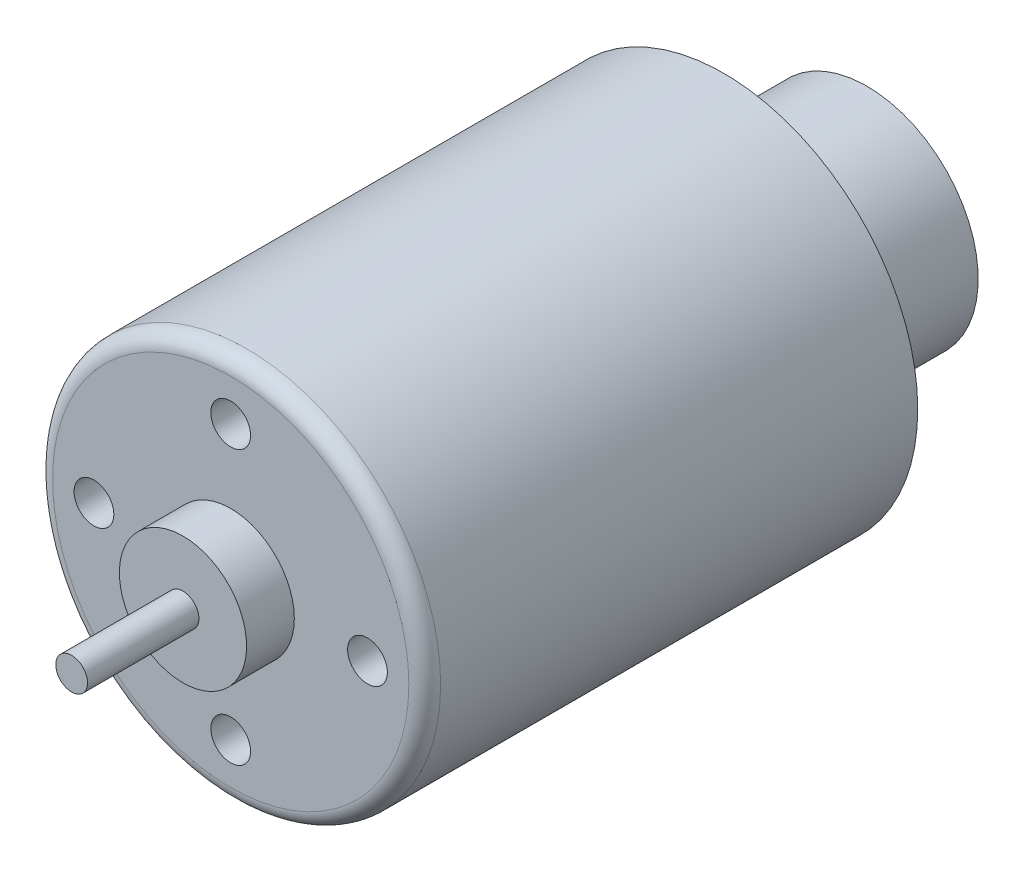
ISO-10303-21;
HEADER;
FILE_DESCRIPTION(('STEP AP214'),'2;1');
FILE_NAME('part.step','',(''),(''),'','','');
FILE_SCHEMA(('AUTOMOTIVE_DESIGN { 1 0 10303 214 1 1 1 1 }'));
ENDSEC;
DATA;
#1=APPLICATION_CONTEXT('core data for automotive mechanical design processes');
#2=APPLICATION_PROTOCOL_DEFINITION('international standard','automotive_design',2000,#1);
#3=PRODUCT_CONTEXT('',#1,'mechanical');
#4=PRODUCT('Part','Part','',(#3));
#5=PRODUCT_RELATED_PRODUCT_CATEGORY('part','',(#4));
#6=PRODUCT_DEFINITION_FORMATION('','',#4);
#7=PRODUCT_DEFINITION_CONTEXT('part definition',#1,'design');
#8=PRODUCT_DEFINITION('design','',#6,#7);
#9=PRODUCT_DEFINITION_SHAPE('','',#8);
#10=(LENGTH_UNIT() NAMED_UNIT(*) SI_UNIT(.MILLI.,.METRE.));
#11=(NAMED_UNIT(*) PLANE_ANGLE_UNIT() SI_UNIT($,.RADIAN.));
#12=(NAMED_UNIT(*) SI_UNIT($,.STERADIAN.) SOLID_ANGLE_UNIT());
#13=UNCERTAINTY_MEASURE_WITH_UNIT(LENGTH_MEASURE(1.E-05),#10,'distance_accuracy_value','');
#14=(GEOMETRIC_REPRESENTATION_CONTEXT(3) GLOBAL_UNCERTAINTY_ASSIGNED_CONTEXT((#13)) GLOBAL_UNIT_ASSIGNED_CONTEXT((#10,
#11,#12)) REPRESENTATION_CONTEXT('',''));
#15=CARTESIAN_POINT('',(0.,0.,0.));
#16=DIRECTION('',(0.,0.,1.));
#17=DIRECTION('',(1.,0.,0.));
#18=AXIS2_PLACEMENT_3D('',#15,#16,#17);
#19=CARTESIAN_POINT('',(0.,0.,31.));
#20=DIRECTION('',(0.,0.,-1.));
#21=DIRECTION('',(-1.,0.,0.));
#22=AXIS2_PLACEMENT_3D('',#19,#20,#21);
#23=CYLINDRICAL_SURFACE('',#22,12.2);
#24=CARTESIAN_POINT('',(0.,0.,30.));
#25=DIRECTION('',(0.,0.,1.));
#26=DIRECTION('',(1.,0.,0.));
#27=AXIS2_PLACEMENT_3D('',#24,#25,#26);
#28=CIRCLE('',#27,12.2);
#29=CARTESIAN_POINT('',(12.2,0.,30.));
#30=VERTEX_POINT('',#29);
#31=EDGE_CURVE('E11',#30,#30,#28,.F.);
#32=ORIENTED_EDGE('',*,*,#31,.T.);
#33=EDGE_LOOP('',(#32));
#34=FACE_BOUND('',#33,.T.);
#35=CARTESIAN_POINT('',(0.,0.,0.));
#36=DIRECTION('',(0.,0.,1.));
#37=DIRECTION('',(1.,0.,0.));
#38=AXIS2_PLACEMENT_3D('',#35,#36,#37);
#39=CIRCLE('',#38,12.2);
#40=CARTESIAN_POINT('',(12.2,0.,0.));
#41=VERTEX_POINT('',#40);
#42=EDGE_CURVE('E104',#41,#41,#39,.T.);
#43=ORIENTED_EDGE('',*,*,#42,.T.);
#44=EDGE_LOOP('',(#43));
#45=FACE_BOUND('',#44,.T.);
#46=ADVANCED_FACE('F39',(#34,#45),#23,.T.);
#47=CARTESIAN_POINT('',(0.,0.,31.));
#48=DIRECTION('',(0.,0.,1.));
#49=DIRECTION('',(1.,0.,0.));
#50=AXIS2_PLACEMENT_3D('',#47,#48,#49);
#51=PLANE('',#50);
#52=CARTESIAN_POINT('',(0.,0.,31.));
#53=DIRECTION('',(0.,0.,1.));
#54=DIRECTION('',(1.,0.,0.));
#55=AXIS2_PLACEMENT_3D('',#52,#53,#54);
#56=CIRCLE('',#55,11.2);
#57=CARTESIAN_POINT('',(11.2,0.,31.));
#58=VERTEX_POINT('',#57);
#59=EDGE_CURVE('E48',#58,#58,#56,.T.);
#60=ORIENTED_EDGE('',*,*,#59,.T.);
#61=EDGE_LOOP('',(#60));
#62=FACE_BOUND('',#61,.T.);
#63=CARTESIAN_POINT('',(0.,0.,31.));
#64=DIRECTION('',(0.,0.,1.));
#65=DIRECTION('',(1.,0.,0.));
#66=AXIS2_PLACEMENT_3D('',#63,#64,#65);
#67=CIRCLE('',#66,4.);
#68=CARTESIAN_POINT('',(4.,0.,31.));
#69=VERTEX_POINT('',#68);
#70=EDGE_CURVE('E127',#69,#69,#67,.T.);
#71=ORIENTED_EDGE('',*,*,#70,.F.);
#72=EDGE_LOOP('',(#71));
#73=FACE_BOUND('',#72,.T.);
#74=CARTESIAN_POINT('',(-8.6,0.,31.));
#75=DIRECTION('',(0.,0.,1.));
#76=DIRECTION('',(1.,0.,0.));
#77=AXIS2_PLACEMENT_3D('',#74,#75,#76);
#78=CIRCLE('',#77,1.24999999999999);
#79=CARTESIAN_POINT('',(-7.35000000000001,0.,31.));
#80=VERTEX_POINT('',#79);
#81=EDGE_CURVE('E73',#80,#80,#78,.T.);
#82=ORIENTED_EDGE('',*,*,#81,.F.);
#83=EDGE_LOOP('',(#82));
#84=FACE_BOUND('',#83,.T.);
#85=CARTESIAN_POINT('',(0.,8.6,31.));
#86=DIRECTION('',(0.,0.,1.));
#87=DIRECTION('',(1.,0.,0.));
#88=AXIS2_PLACEMENT_3D('',#85,#86,#87);
#89=CIRCLE('',#88,1.24999999999999);
#90=CARTESIAN_POINT('',(1.24999999999999,8.6,31.));
#91=VERTEX_POINT('',#90);
#92=EDGE_CURVE('E72',#91,#91,#89,.T.);
#93=ORIENTED_EDGE('',*,*,#92,.F.);
#94=EDGE_LOOP('',(#93));
#95=FACE_BOUND('',#94,.T.);
#96=CARTESIAN_POINT('',(8.6,0.,31.));
#97=DIRECTION('',(0.,0.,1.));
#98=DIRECTION('',(1.,0.,0.));
#99=AXIS2_PLACEMENT_3D('',#96,#97,#98);
#100=CIRCLE('',#99,1.24999999999999);
#101=CARTESIAN_POINT('',(9.84999999999999,0.,31.));
#102=VERTEX_POINT('',#101);
#103=EDGE_CURVE('E88',#102,#102,#100,.T.);
#104=ORIENTED_EDGE('',*,*,#103,.F.);
#105=EDGE_LOOP('',(#104));
#106=FACE_BOUND('',#105,.T.);
#107=CARTESIAN_POINT('',(0.,-8.6,31.));
#108=DIRECTION('',(0.,0.,1.));
#109=DIRECTION('',(1.,0.,0.));
#110=AXIS2_PLACEMENT_3D('',#107,#108,#109);
#111=CIRCLE('',#110,1.24999999999999);
#112=CARTESIAN_POINT('',(1.24999999999999,-8.6,31.));
#113=VERTEX_POINT('',#112);
#114=EDGE_CURVE('E96',#113,#113,#111,.T.);
#115=ORIENTED_EDGE('',*,*,#114,.F.);
#116=EDGE_LOOP('',(#115));
#117=FACE_BOUND('',#116,.T.);
#118=ADVANCED_FACE('F137',(#62,#73,#84,#95,#106,#117),#51,.T.);
#119=CARTESIAN_POINT('',(0.,0.,0.));
#120=DIRECTION('',(0.,0.,1.));
#121=DIRECTION('',(1.,0.,0.));
#122=AXIS2_PLACEMENT_3D('',#119,#120,#121);
#123=PLANE('',#122);
#124=CARTESIAN_POINT('',(0.,0.,0.));
#125=DIRECTION('',(0.,0.,-1.));
#126=DIRECTION('',(-1.,0.,0.));
#127=AXIS2_PLACEMENT_3D('',#124,#125,#126);
#128=CIRCLE('',#127,7.);
#129=CARTESIAN_POINT('',(-7.,0.,0.));
#130=VERTEX_POINT('',#129);
#131=EDGE_CURVE('E110',#130,#130,#128,.T.);
#132=ORIENTED_EDGE('',*,*,#131,.F.);
#133=EDGE_LOOP('',(#132));
#134=FACE_BOUND('',#133,.T.);
#135=ORIENTED_EDGE('',*,*,#42,.F.);
#136=EDGE_LOOP('',(#135));
#137=FACE_BOUND('',#136,.T.);
#138=ADVANCED_FACE('F140',(#134,#137),#123,.F.);
#139=CARTESIAN_POINT('',(0.,-8.6,28.));
#140=DIRECTION('',(0.,0.,1.));
#141=DIRECTION('',(1.,0.,0.));
#142=AXIS2_PLACEMENT_3D('',#139,#140,#141);
#143=CONICAL_SURFACE('',#142,1.25,1.02974425867665);
#144=CARTESIAN_POINT('',(0.,-8.6,27.2489242262155));
#145=VERTEX_POINT('',#144);
#146=VERTEX_LOOP('',#145);
#147=FACE_BOUND('',#146,.T.);
#148=CARTESIAN_POINT('',(0.,-8.6,28.));
#149=DIRECTION('',(0.,0.,1.));
#150=DIRECTION('',(1.,0.,0.));
#151=AXIS2_PLACEMENT_3D('',#148,#149,#150);
#152=CIRCLE('',#151,1.25);
#153=CARTESIAN_POINT('',(1.25,-8.6,28.));
#154=VERTEX_POINT('',#153);
#155=EDGE_CURVE('E100',#154,#154,#152,.T.);
#156=ORIENTED_EDGE('',*,*,#155,.T.);
#157=EDGE_LOOP('',(#156));
#158=FACE_BOUND('',#157,.T.);
#159=ADVANCED_FACE('F153',(#147,#158),#143,.F.);
#160=CARTESIAN_POINT('',(0.,-8.6,31.));
#161=DIRECTION('',(0.,0.,1.));
#162=DIRECTION('',(1.,0.,0.));
#163=AXIS2_PLACEMENT_3D('',#160,#161,#162);
#164=CYLINDRICAL_SURFACE('',#163,1.24999999999999);
#165=ORIENTED_EDGE('',*,*,#155,.F.);
#166=EDGE_LOOP('',(#165));
#167=FACE_BOUND('',#166,.T.);
#168=ORIENTED_EDGE('',*,*,#114,.T.);
#169=EDGE_LOOP('',(#168));
#170=FACE_BOUND('',#169,.T.);
#171=ADVANCED_FACE('F150',(#167,#170),#164,.F.);
#172=CARTESIAN_POINT('',(8.6,0.,28.));
#173=DIRECTION('',(0.,0.,1.));
#174=DIRECTION('',(1.,0.,0.));
#175=AXIS2_PLACEMENT_3D('',#172,#173,#174);
#176=CONICAL_SURFACE('',#175,1.25,1.02974425867665);
#177=CARTESIAN_POINT('',(8.6,0.,27.2489242262155));
#178=VERTEX_POINT('',#177);
#179=VERTEX_LOOP('',#178);
#180=FACE_BOUND('',#179,.T.);
#181=CARTESIAN_POINT('',(8.6,0.,28.));
#182=DIRECTION('',(0.,0.,1.));
#183=DIRECTION('',(1.,0.,0.));
#184=AXIS2_PLACEMENT_3D('',#181,#182,#183);
#185=CIRCLE('',#184,1.25);
#186=CARTESIAN_POINT('',(9.85,0.,28.));
#187=VERTEX_POINT('',#186);
#188=EDGE_CURVE('E92',#187,#187,#185,.T.);
#189=ORIENTED_EDGE('',*,*,#188,.T.);
#190=EDGE_LOOP('',(#189));
#191=FACE_BOUND('',#190,.T.);
#192=ADVANCED_FACE('F152',(#180,#191),#176,.F.);
#193=CARTESIAN_POINT('',(8.6,0.,31.));
#194=DIRECTION('',(0.,0.,1.));
#195=DIRECTION('',(1.,0.,0.));
#196=AXIS2_PLACEMENT_3D('',#193,#194,#195);
#197=CYLINDRICAL_SURFACE('',#196,1.24999999999999);
#198=ORIENTED_EDGE('',*,*,#188,.F.);
#199=EDGE_LOOP('',(#198));
#200=FACE_BOUND('',#199,.T.);
#201=ORIENTED_EDGE('',*,*,#103,.T.);
#202=EDGE_LOOP('',(#201));
#203=FACE_BOUND('',#202,.T.);
#204=ADVANCED_FACE('F160',(#200,#203),#197,.F.);
#205=CARTESIAN_POINT('',(0.,8.6,28.));
#206=DIRECTION('',(0.,0.,1.));
#207=DIRECTION('',(1.,0.,0.));
#208=AXIS2_PLACEMENT_3D('',#205,#206,#207);
#209=CONICAL_SURFACE('',#208,1.25,1.02974425867665);
#210=CARTESIAN_POINT('',(0.,8.6,27.2489242262155));
#211=VERTEX_POINT('',#210);
#212=VERTEX_LOOP('',#211);
#213=FACE_BOUND('',#212,.T.);
#214=CARTESIAN_POINT('',(0.,8.6,28.));
#215=DIRECTION('',(0.,0.,1.));
#216=DIRECTION('',(1.,0.,0.));
#217=AXIS2_PLACEMENT_3D('',#214,#215,#216);
#218=CIRCLE('',#217,1.25);
#219=CARTESIAN_POINT('',(1.25,8.6,28.));
#220=VERTEX_POINT('',#219);
#221=EDGE_CURVE('E78',#220,#220,#218,.T.);
#222=ORIENTED_EDGE('',*,*,#221,.T.);
#223=EDGE_LOOP('',(#222));
#224=FACE_BOUND('',#223,.T.);
#225=ADVANCED_FACE('F203',(#213,#224),#209,.F.);
#226=CARTESIAN_POINT('',(0.,8.6,31.));
#227=DIRECTION('',(0.,0.,1.));
#228=DIRECTION('',(1.,0.,0.));
#229=AXIS2_PLACEMENT_3D('',#226,#227,#228);
#230=CYLINDRICAL_SURFACE('',#229,1.24999999999999);
#231=ORIENTED_EDGE('',*,*,#221,.F.);
#232=EDGE_LOOP('',(#231));
#233=FACE_BOUND('',#232,.T.);
#234=ORIENTED_EDGE('',*,*,#92,.T.);
#235=EDGE_LOOP('',(#234));
#236=FACE_BOUND('',#235,.T.);
#237=ADVANCED_FACE('F65',(#233,#236),#230,.F.);
#238=CARTESIAN_POINT('',(-8.6,0.,28.));
#239=DIRECTION('',(0.,0.,1.));
#240=DIRECTION('',(1.,0.,0.));
#241=AXIS2_PLACEMENT_3D('',#238,#239,#240);
#242=CONICAL_SURFACE('',#241,1.25,1.02974425867665);
#243=CARTESIAN_POINT('',(-8.6,0.,27.2489242262155));
#244=VERTEX_POINT('',#243);
#245=VERTEX_LOOP('',#244);
#246=FACE_BOUND('',#245,.T.);
#247=CARTESIAN_POINT('',(-8.6,0.,28.));
#248=DIRECTION('',(0.,0.,1.));
#249=DIRECTION('',(1.,0.,0.));
#250=AXIS2_PLACEMENT_3D('',#247,#248,#249);
#251=CIRCLE('',#250,1.25);
#252=CARTESIAN_POINT('',(-7.35,0.,28.));
#253=VERTEX_POINT('',#252);
#254=EDGE_CURVE('E69',#253,#253,#251,.T.);
#255=ORIENTED_EDGE('',*,*,#254,.T.);
#256=EDGE_LOOP('',(#255));
#257=FACE_BOUND('',#256,.T.);
#258=ADVANCED_FACE('F61',(#246,#257),#242,.F.);
#259=CARTESIAN_POINT('',(-8.6,0.,31.));
#260=DIRECTION('',(0.,0.,1.));
#261=DIRECTION('',(1.,0.,0.));
#262=AXIS2_PLACEMENT_3D('',#259,#260,#261);
#263=CYLINDRICAL_SURFACE('',#262,1.24999999999999);
#264=ORIENTED_EDGE('',*,*,#254,.F.);
#265=EDGE_LOOP('',(#264));
#266=FACE_BOUND('',#265,.T.);
#267=ORIENTED_EDGE('',*,*,#81,.T.);
#268=EDGE_LOOP('',(#267));
#269=FACE_BOUND('',#268,.T.);
#270=ADVANCED_FACE('F64',(#266,#269),#263,.F.);
#271=CARTESIAN_POINT('',(0.,0.,34.));
#272=DIRECTION('',(0.,0.,-1.));
#273=DIRECTION('',(-1.,0.,0.));
#274=AXIS2_PLACEMENT_3D('',#271,#272,#273);
#275=CYLINDRICAL_SURFACE('',#274,4.);
#276=CARTESIAN_POINT('',(0.,0.,34.));
#277=DIRECTION('',(0.,0.,1.));
#278=DIRECTION('',(1.,0.,0.));
#279=AXIS2_PLACEMENT_3D('',#276,#277,#278);
#280=CIRCLE('',#279,4.);
#281=CARTESIAN_POINT('',(4.,0.,34.));
#282=VERTEX_POINT('',#281);
#283=EDGE_CURVE('E81',#282,#282,#280,.T.);
#284=ORIENTED_EDGE('',*,*,#283,.F.);
#285=EDGE_LOOP('',(#284));
#286=FACE_BOUND('',#285,.T.);
#287=ORIENTED_EDGE('',*,*,#70,.T.);
#288=EDGE_LOOP('',(#287));
#289=FACE_BOUND('',#288,.T.);
#290=ADVANCED_FACE('F135',(#286,#289),#275,.T.);
#291=CARTESIAN_POINT('',(0.,0.,34.));
#292=DIRECTION('',(0.,0.,1.));
#293=DIRECTION('',(1.,0.,0.));
#294=AXIS2_PLACEMENT_3D('',#291,#292,#293);
#295=PLANE('',#294);
#296=CARTESIAN_POINT('',(0.,0.,34.));
#297=DIRECTION('',(0.,0.,1.));
#298=DIRECTION('',(1.,0.,0.));
#299=AXIS2_PLACEMENT_3D('',#296,#297,#298);
#300=CIRCLE('',#299,1.);
#301=CARTESIAN_POINT('',(1.,0.,34.));
#302=VERTEX_POINT('',#301);
#303=EDGE_CURVE('E107',#302,#302,#300,.T.);
#304=ORIENTED_EDGE('',*,*,#303,.F.);
#305=EDGE_LOOP('',(#304));
#306=FACE_BOUND('',#305,.T.);
#307=ORIENTED_EDGE('',*,*,#283,.T.);
#308=EDGE_LOOP('',(#307));
#309=FACE_BOUND('',#308,.T.);
#310=ADVANCED_FACE('F245',(#306,#309),#295,.T.);
#311=CARTESIAN_POINT('',(0.,0.,41.));
#312=DIRECTION('',(0.,0.,-1.));
#313=DIRECTION('',(-1.,0.,0.));
#314=AXIS2_PLACEMENT_3D('',#311,#312,#313);
#315=CYLINDRICAL_SURFACE('',#314,1.);
#316=CARTESIAN_POINT('',(0.,0.,41.));
#317=DIRECTION('',(0.,0.,1.));
#318=DIRECTION('',(1.,0.,0.));
#319=AXIS2_PLACEMENT_3D('',#316,#317,#318);
#320=CIRCLE('',#319,1.);
#321=CARTESIAN_POINT('',(1.,0.,41.));
#322=VERTEX_POINT('',#321);
#323=EDGE_CURVE('E124',#322,#322,#320,.T.);
#324=ORIENTED_EDGE('',*,*,#323,.F.);
#325=EDGE_LOOP('',(#324));
#326=FACE_BOUND('',#325,.T.);
#327=ORIENTED_EDGE('',*,*,#303,.T.);
#328=EDGE_LOOP('',(#327));
#329=FACE_BOUND('',#328,.T.);
#330=ADVANCED_FACE('F255',(#326,#329),#315,.T.);
#331=CARTESIAN_POINT('',(0.,0.,41.));
#332=DIRECTION('',(0.,0.,1.));
#333=DIRECTION('',(1.,0.,0.));
#334=AXIS2_PLACEMENT_3D('',#331,#332,#333);
#335=PLANE('',#334);
#336=ORIENTED_EDGE('',*,*,#323,.T.);
#337=EDGE_LOOP('',(#336));
#338=FACE_BOUND('',#337,.T.);
#339=ADVANCED_FACE('F264',(#338),#335,.T.);
#340=CARTESIAN_POINT('',(0.,0.,-9.));
#341=DIRECTION('',(0.,0.,1.));
#342=DIRECTION('',(1.,0.,0.));
#343=AXIS2_PLACEMENT_3D('',#340,#341,#342);
#344=CYLINDRICAL_SURFACE('',#343,7.);
#345=CARTESIAN_POINT('',(0.,0.,-9.));
#346=DIRECTION('',(0.,0.,-1.));
#347=DIRECTION('',(-1.,0.,0.));
#348=AXIS2_PLACEMENT_3D('',#345,#346,#347);
#349=CIRCLE('',#348,7.);
#350=CARTESIAN_POINT('',(-7.,0.,-9.));
#351=VERTEX_POINT('',#350);
#352=EDGE_CURVE('E123',#351,#351,#349,.T.);
#353=ORIENTED_EDGE('',*,*,#352,.F.);
#354=EDGE_LOOP('',(#353));
#355=FACE_BOUND('',#354,.T.);
#356=ORIENTED_EDGE('',*,*,#131,.T.);
#357=EDGE_LOOP('',(#356));
#358=FACE_BOUND('',#357,.T.);
#359=ADVANCED_FACE('F273',(#355,#358),#344,.T.);
#360=CARTESIAN_POINT('',(0.,0.,-9.));
#361=DIRECTION('',(0.,0.,-1.));
#362=DIRECTION('',(-1.,0.,0.));
#363=AXIS2_PLACEMENT_3D('',#360,#361,#362);
#364=PLANE('',#363);
#365=ORIENTED_EDGE('',*,*,#352,.T.);
#366=EDGE_LOOP('',(#365));
#367=FACE_BOUND('',#366,.T.);
#368=ADVANCED_FACE('F283',(#367),#364,.T.);
#369=CARTESIAN_POINT('',(0.,0.,30.));
#370=DIRECTION('',(0.,0.,1.));
#371=DIRECTION('',(1.,0.,0.));
#372=AXIS2_PLACEMENT_3D('',#369,#370,#371);
#373=TOROIDAL_SURFACE('',#372,11.2,1.);
#374=ORIENTED_EDGE('',*,*,#31,.F.);
#375=EDGE_LOOP('',(#374));
#376=FACE_BOUND('',#375,.T.);
#377=ORIENTED_EDGE('',*,*,#59,.F.);
#378=EDGE_LOOP('',(#377));
#379=FACE_BOUND('',#378,.T.);
#380=ADVANCED_FACE('F41',(#376,#379),#373,.T.);
#381=CLOSED_SHELL('',(#46,#118,#138,#159,#171,#192,#204,#225,#237,#258,#270,#290,#310,#330,#339,
#359,#368,#380));
#382=MANIFOLD_SOLID_BREP('B2',#381);
#383=ADVANCED_BREP_SHAPE_REPRESENTATION('',(#18,#382),#14);
#384=SHAPE_DEFINITION_REPRESENTATION(#9,#383);
ENDSEC;
END-ISO-10303-21;
